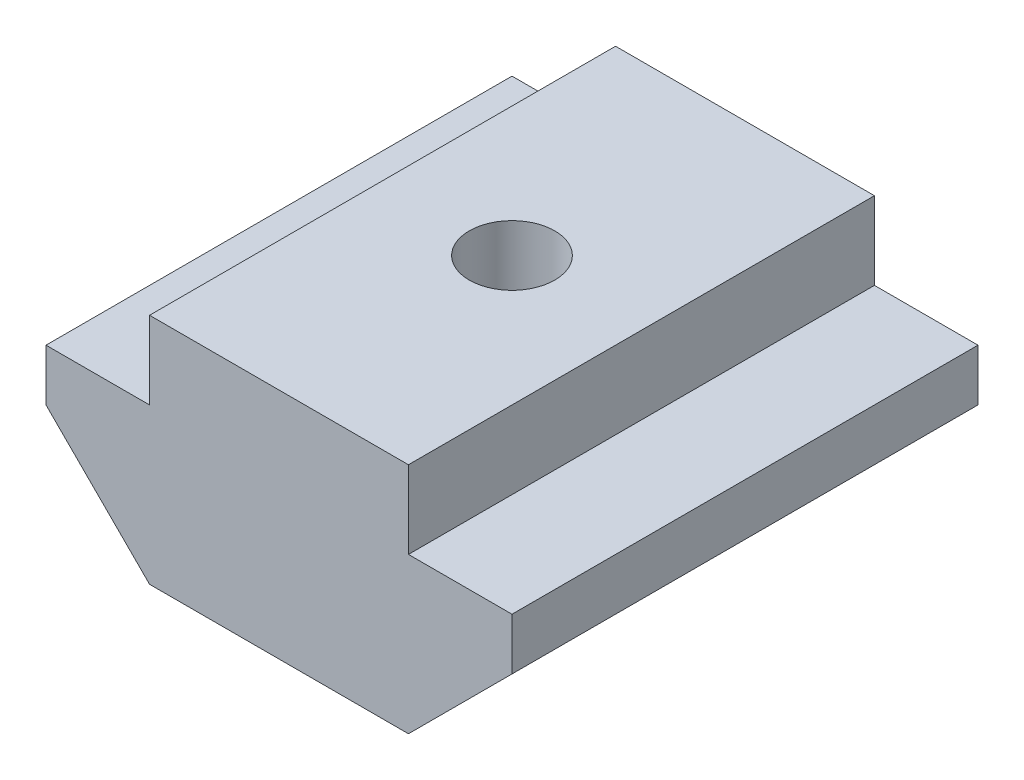
ISO-10303-21;
HEADER;
FILE_DESCRIPTION(('STEP AP214'),'2;1');
FILE_NAME('part.step','',(''),(''),'','','');
FILE_SCHEMA(('AUTOMOTIVE_DESIGN { 1 0 10303 214 1 1 1 1 }'));
ENDSEC;
DATA;
#1=APPLICATION_CONTEXT('core data for automotive mechanical design processes');
#2=APPLICATION_PROTOCOL_DEFINITION('international standard','automotive_design',2000,#1);
#3=PRODUCT_CONTEXT('',#1,'mechanical');
#4=PRODUCT('Part','Part','',(#3));
#5=PRODUCT_RELATED_PRODUCT_CATEGORY('part','',(#4));
#6=PRODUCT_DEFINITION_FORMATION('','',#4);
#7=PRODUCT_DEFINITION_CONTEXT('part definition',#1,'design');
#8=PRODUCT_DEFINITION('design','',#6,#7);
#9=PRODUCT_DEFINITION_SHAPE('','',#8);
#10=(LENGTH_UNIT() NAMED_UNIT(*) SI_UNIT(.MILLI.,.METRE.));
#11=(NAMED_UNIT(*) PLANE_ANGLE_UNIT() SI_UNIT($,.RADIAN.));
#12=(NAMED_UNIT(*) SI_UNIT($,.STERADIAN.) SOLID_ANGLE_UNIT());
#13=UNCERTAINTY_MEASURE_WITH_UNIT(LENGTH_MEASURE(1.E-05),#10,'distance_accuracy_value','');
#14=(GEOMETRIC_REPRESENTATION_CONTEXT(3) GLOBAL_UNCERTAINTY_ASSIGNED_CONTEXT((#13)) GLOBAL_UNIT_ASSIGNED_CONTEXT((#10,
#11,#12)) REPRESENTATION_CONTEXT('',''));
#15=CARTESIAN_POINT('',(0.,0.,0.));
#16=DIRECTION('',(0.,0.,1.));
#17=DIRECTION('',(1.,0.,0.));
#18=AXIS2_PLACEMENT_3D('',#15,#16,#17);
#19=CARTESIAN_POINT('',(0.,-2.,18.));
#20=DIRECTION('',(1.,0.,0.));
#21=DIRECTION('',(0.,0.,-1.));
#22=AXIS2_PLACEMENT_3D('',#19,#20,#21);
#23=PLANE('',#22);
#24=DIRECTION('',(0.,-1.,0.));
#25=VECTOR('',#24,1.);
#26=CARTESIAN_POINT('',(0.,-2.,0.));
#27=LINE('',#26,#25);
#28=CARTESIAN_POINT('',(0.,0.,0.));
#29=VERTEX_POINT('',#28);
#30=CARTESIAN_POINT('',(0.,-2.,0.));
#31=VERTEX_POINT('',#30);
#32=EDGE_CURVE('E153',#29,#31,#27,.T.);
#33=ORIENTED_EDGE('',*,*,#32,.T.);
#34=DIRECTION('',(0.,0.,-1.));
#35=VECTOR('',#34,1.);
#36=CARTESIAN_POINT('',(0.,-2.,18.));
#37=LINE('',#36,#35);
#38=CARTESIAN_POINT('',(0.,-2.,18.));
#39=VERTEX_POINT('',#38);
#40=EDGE_CURVE('E11',#39,#31,#37,.T.);
#41=ORIENTED_EDGE('',*,*,#40,.F.);
#42=DIRECTION('',(0.,-1.,0.));
#43=VECTOR('',#42,1.);
#44=CARTESIAN_POINT('',(0.,-2.,18.));
#45=LINE('',#44,#43);
#46=CARTESIAN_POINT('',(0.,0.,18.));
#47=VERTEX_POINT('',#46);
#48=EDGE_CURVE('E171',#47,#39,#45,.T.);
#49=ORIENTED_EDGE('',*,*,#48,.F.);
#50=DIRECTION('',(0.,0.,-1.));
#51=VECTOR('',#50,1.);
#52=CARTESIAN_POINT('',(0.,0.,18.));
#53=LINE('',#52,#51);
#54=EDGE_CURVE('E149',#47,#29,#53,.T.);
#55=ORIENTED_EDGE('',*,*,#54,.T.);
#56=EDGE_LOOP('',(#33,#41,#49,#55));
#57=FACE_BOUND('',#56,.T.);
#58=ADVANCED_FACE('F44',(#57),#23,.F.);
#59=CARTESIAN_POINT('',(4.,-6.,18.));
#60=DIRECTION('',(0.707106781186548,0.707106781186547,0.));
#61=DIRECTION('',(-0.707106781186547,0.707106781186548,0.));
#62=AXIS2_PLACEMENT_3D('',#59,#60,#61);
#63=PLANE('',#62);
#64=DIRECTION('',(0.707106781186547,-0.707106781186548,0.));
#65=VECTOR('',#64,1.);
#66=CARTESIAN_POINT('',(4.,-6.,0.));
#67=LINE('',#66,#65);
#68=CARTESIAN_POINT('',(4.,-6.,0.));
#69=VERTEX_POINT('',#68);
#70=EDGE_CURVE('E156',#31,#69,#67,.T.);
#71=ORIENTED_EDGE('',*,*,#70,.T.);
#72=DIRECTION('',(0.,0.,-1.));
#73=VECTOR('',#72,1.);
#74=CARTESIAN_POINT('',(4.,-6.,18.));
#75=LINE('',#74,#73);
#76=CARTESIAN_POINT('',(4.,-6.,18.));
#77=VERTEX_POINT('',#76);
#78=EDGE_CURVE('E52',#77,#69,#75,.T.);
#79=ORIENTED_EDGE('',*,*,#78,.F.);
#80=DIRECTION('',(0.707106781186547,-0.707106781186548,0.));
#81=VECTOR('',#80,1.);
#82=CARTESIAN_POINT('',(4.,-6.,18.));
#83=LINE('',#82,#81);
#84=EDGE_CURVE('E109',#39,#77,#83,.T.);
#85=ORIENTED_EDGE('',*,*,#84,.F.);
#86=ORIENTED_EDGE('',*,*,#40,.T.);
#87=EDGE_LOOP('',(#71,#79,#85,#86));
#88=FACE_BOUND('',#87,.T.);
#89=ADVANCED_FACE('F250',(#88),#63,.F.);
#90=CARTESIAN_POINT('',(14.,-6.,18.));
#91=DIRECTION('',(0.,1.,0.));
#92=DIRECTION('',(-1.,0.,0.));
#93=AXIS2_PLACEMENT_3D('',#90,#91,#92);
#94=PLANE('',#93);
#95=CARTESIAN_POINT('',(9.,-6.,9.));
#96=DIRECTION('',(0.,1.,0.));
#97=DIRECTION('',(0.,0.,1.));
#98=AXIS2_PLACEMENT_3D('',#95,#96,#97);
#99=CIRCLE('',#98,1.65);
#100=CARTESIAN_POINT('',(9.,-6.,10.65));
#101=VERTEX_POINT('',#100);
#102=EDGE_CURVE('E222',#101,#101,#99,.T.);
#103=ORIENTED_EDGE('',*,*,#102,.T.);
#104=EDGE_LOOP('',(#103));
#105=FACE_BOUND('',#104,.T.);
#106=DIRECTION('',(1.,0.,0.));
#107=VECTOR('',#106,1.);
#108=CARTESIAN_POINT('',(14.,-6.,0.));
#109=LINE('',#108,#107);
#110=CARTESIAN_POINT('',(14.,-6.,0.));
#111=VERTEX_POINT('',#110);
#112=EDGE_CURVE('E157',#69,#111,#109,.T.);
#113=ORIENTED_EDGE('',*,*,#112,.T.);
#114=DIRECTION('',(0.,0.,-1.));
#115=VECTOR('',#114,1.);
#116=CARTESIAN_POINT('',(14.,-6.,18.));
#117=LINE('',#116,#115);
#118=CARTESIAN_POINT('',(14.,-6.,18.));
#119=VERTEX_POINT('',#118);
#120=EDGE_CURVE('E183',#119,#111,#117,.T.);
#121=ORIENTED_EDGE('',*,*,#120,.F.);
#122=DIRECTION('',(1.,0.,0.));
#123=VECTOR('',#122,1.);
#124=CARTESIAN_POINT('',(14.,-6.,18.));
#125=LINE('',#124,#123);
#126=EDGE_CURVE('E192',#77,#119,#125,.T.);
#127=ORIENTED_EDGE('',*,*,#126,.F.);
#128=ORIENTED_EDGE('',*,*,#78,.T.);
#129=EDGE_LOOP('',(#113,#121,#127,#128));
#130=FACE_BOUND('',#129,.T.);
#131=ADVANCED_FACE('F191',(#105,#130),#94,.F.);
#132=CARTESIAN_POINT('',(18.,-2.,18.));
#133=DIRECTION('',(-0.707106781186548,0.707106781186547,0.));
#134=DIRECTION('',(-0.707106781186547,-0.707106781186548,0.));
#135=AXIS2_PLACEMENT_3D('',#132,#133,#134);
#136=PLANE('',#135);
#137=DIRECTION('',(0.707106781186547,0.707106781186548,0.));
#138=VECTOR('',#137,1.);
#139=CARTESIAN_POINT('',(18.,-2.,0.));
#140=LINE('',#139,#138);
#141=CARTESIAN_POINT('',(18.,-2.,0.));
#142=VERTEX_POINT('',#141);
#143=EDGE_CURVE('E161',#111,#142,#140,.T.);
#144=ORIENTED_EDGE('',*,*,#143,.T.);
#145=DIRECTION('',(0.,0.,-1.));
#146=VECTOR('',#145,1.);
#147=CARTESIAN_POINT('',(18.,-2.,18.));
#148=LINE('',#147,#146);
#149=CARTESIAN_POINT('',(18.,-2.,18.));
#150=VERTEX_POINT('',#149);
#151=EDGE_CURVE('E185',#150,#142,#148,.T.);
#152=ORIENTED_EDGE('',*,*,#151,.F.);
#153=DIRECTION('',(0.707106781186547,0.707106781186548,0.));
#154=VECTOR('',#153,1.);
#155=CARTESIAN_POINT('',(18.,-2.,18.));
#156=LINE('',#155,#154);
#157=EDGE_CURVE('E211',#119,#150,#156,.T.);
#158=ORIENTED_EDGE('',*,*,#157,.F.);
#159=ORIENTED_EDGE('',*,*,#120,.T.);
#160=EDGE_LOOP('',(#144,#152,#158,#159));
#161=FACE_BOUND('',#160,.T.);
#162=ADVANCED_FACE('F205',(#161),#136,.F.);
#163=CARTESIAN_POINT('',(18.,0.,18.));
#164=DIRECTION('',(-1.,0.,0.));
#165=DIRECTION('',(0.,0.,1.));
#166=AXIS2_PLACEMENT_3D('',#163,#164,#165);
#167=PLANE('',#166);
#168=DIRECTION('',(0.,1.,0.));
#169=VECTOR('',#168,1.);
#170=CARTESIAN_POINT('',(18.,0.,0.));
#171=LINE('',#170,#169);
#172=CARTESIAN_POINT('',(18.,0.,0.));
#173=VERTEX_POINT('',#172);
#174=EDGE_CURVE('E162',#142,#173,#171,.T.);
#175=ORIENTED_EDGE('',*,*,#174,.T.);
#176=DIRECTION('',(0.,0.,-1.));
#177=VECTOR('',#176,1.);
#178=CARTESIAN_POINT('',(18.,0.,18.));
#179=LINE('',#178,#177);
#180=CARTESIAN_POINT('',(18.,0.,18.));
#181=VERTEX_POINT('',#180);
#182=EDGE_CURVE('E178',#181,#173,#179,.T.);
#183=ORIENTED_EDGE('',*,*,#182,.F.);
#184=DIRECTION('',(0.,1.,0.));
#185=VECTOR('',#184,1.);
#186=CARTESIAN_POINT('',(18.,0.,18.));
#187=LINE('',#186,#185);
#188=EDGE_CURVE('E208',#150,#181,#187,.T.);
#189=ORIENTED_EDGE('',*,*,#188,.F.);
#190=ORIENTED_EDGE('',*,*,#151,.T.);
#191=EDGE_LOOP('',(#175,#183,#189,#190));
#192=FACE_BOUND('',#191,.T.);
#193=ADVANCED_FACE('F206',(#192),#167,.F.);
#194=CARTESIAN_POINT('',(14.,0.,18.));
#195=DIRECTION('',(0.,-1.,0.));
#196=DIRECTION('',(0.,0.,-1.));
#197=AXIS2_PLACEMENT_3D('',#194,#195,#196);
#198=PLANE('',#197);
#199=DIRECTION('',(-1.,0.,0.));
#200=VECTOR('',#199,1.);
#201=CARTESIAN_POINT('',(14.,0.,0.));
#202=LINE('',#201,#200);
#203=CARTESIAN_POINT('',(14.,0.,0.));
#204=VERTEX_POINT('',#203);
#205=EDGE_CURVE('E164',#173,#204,#202,.T.);
#206=ORIENTED_EDGE('',*,*,#205,.T.);
#207=DIRECTION('',(0.,0.,-1.));
#208=VECTOR('',#207,1.);
#209=CARTESIAN_POINT('',(14.,0.,18.));
#210=LINE('',#209,#208);
#211=CARTESIAN_POINT('',(14.,0.,18.));
#212=VERTEX_POINT('',#211);
#213=EDGE_CURVE('E176',#212,#204,#210,.T.);
#214=ORIENTED_EDGE('',*,*,#213,.F.);
#215=DIRECTION('',(-1.,0.,0.));
#216=VECTOR('',#215,1.);
#217=CARTESIAN_POINT('',(14.,0.,18.));
#218=LINE('',#217,#216);
#219=EDGE_CURVE('E209',#181,#212,#218,.T.);
#220=ORIENTED_EDGE('',*,*,#219,.F.);
#221=ORIENTED_EDGE('',*,*,#182,.T.);
#222=EDGE_LOOP('',(#206,#214,#220,#221));
#223=FACE_BOUND('',#222,.T.);
#224=ADVANCED_FACE('F245',(#223),#198,.F.);
#225=CARTESIAN_POINT('',(14.,3.,18.));
#226=DIRECTION('',(-1.,0.,0.));
#227=DIRECTION('',(0.,-1.,0.));
#228=AXIS2_PLACEMENT_3D('',#225,#226,#227);
#229=PLANE('',#228);
#230=DIRECTION('',(0.,1.,0.));
#231=VECTOR('',#230,1.);
#232=CARTESIAN_POINT('',(14.,3.,0.));
#233=LINE('',#232,#231);
#234=CARTESIAN_POINT('',(14.,3.,0.));
#235=VERTEX_POINT('',#234);
#236=EDGE_CURVE('E170',#204,#235,#233,.T.);
#237=ORIENTED_EDGE('',*,*,#236,.T.);
#238=DIRECTION('',(0.,0.,-1.));
#239=VECTOR('',#238,1.);
#240=CARTESIAN_POINT('',(14.,3.,18.));
#241=LINE('',#240,#239);
#242=CARTESIAN_POINT('',(14.,3.,18.));
#243=VERTEX_POINT('',#242);
#244=EDGE_CURVE('E145',#243,#235,#241,.T.);
#245=ORIENTED_EDGE('',*,*,#244,.F.);
#246=DIRECTION('',(0.,1.,0.));
#247=VECTOR('',#246,1.);
#248=CARTESIAN_POINT('',(14.,3.,18.));
#249=LINE('',#248,#247);
#250=EDGE_CURVE('E132',#212,#243,#249,.T.);
#251=ORIENTED_EDGE('',*,*,#250,.F.);
#252=ORIENTED_EDGE('',*,*,#213,.T.);
#253=EDGE_LOOP('',(#237,#245,#251,#252));
#254=FACE_BOUND('',#253,.T.);
#255=ADVANCED_FACE('F232',(#254),#229,.F.);
#256=CARTESIAN_POINT('',(4.,3.,18.));
#257=DIRECTION('',(0.,-1.,0.));
#258=DIRECTION('',(0.,0.,-1.));
#259=AXIS2_PLACEMENT_3D('',#256,#257,#258);
#260=PLANE('',#259);
#261=CARTESIAN_POINT('',(9.,3.,9.));
#262=DIRECTION('',(0.,1.,0.));
#263=DIRECTION('',(0.,0.,1.));
#264=AXIS2_PLACEMENT_3D('',#261,#262,#263);
#265=CIRCLE('',#264,1.64999999999999);
#266=CARTESIAN_POINT('',(9.,3.,10.65));
#267=VERTEX_POINT('',#266);
#268=EDGE_CURVE('E160',#267,#267,#265,.T.);
#269=ORIENTED_EDGE('',*,*,#268,.F.);
#270=EDGE_LOOP('',(#269));
#271=FACE_BOUND('',#270,.T.);
#272=DIRECTION('',(-1.,0.,0.));
#273=VECTOR('',#272,1.);
#274=CARTESIAN_POINT('',(4.,3.,0.));
#275=LINE('',#274,#273);
#276=CARTESIAN_POINT('',(4.,3.,0.));
#277=VERTEX_POINT('',#276);
#278=EDGE_CURVE('E141',#235,#277,#275,.T.);
#279=ORIENTED_EDGE('',*,*,#278,.T.);
#280=DIRECTION('',(0.,0.,-1.));
#281=VECTOR('',#280,1.);
#282=CARTESIAN_POINT('',(4.,3.,18.));
#283=LINE('',#282,#281);
#284=CARTESIAN_POINT('',(4.,3.,18.));
#285=VERTEX_POINT('',#284);
#286=EDGE_CURVE('E139',#285,#277,#283,.T.);
#287=ORIENTED_EDGE('',*,*,#286,.F.);
#288=DIRECTION('',(-1.,0.,0.));
#289=VECTOR('',#288,1.);
#290=CARTESIAN_POINT('',(4.,3.,18.));
#291=LINE('',#290,#289);
#292=EDGE_CURVE('E129',#243,#285,#291,.T.);
#293=ORIENTED_EDGE('',*,*,#292,.F.);
#294=ORIENTED_EDGE('',*,*,#244,.T.);
#295=EDGE_LOOP('',(#279,#287,#293,#294));
#296=FACE_BOUND('',#295,.T.);
#297=ADVANCED_FACE('F143',(#271,#296),#260,.F.);
#298=CARTESIAN_POINT('',(4.,0.,18.));
#299=DIRECTION('',(1.,0.,0.));
#300=DIRECTION('',(0.,0.,-1.));
#301=AXIS2_PLACEMENT_3D('',#298,#299,#300);
#302=PLANE('',#301);
#303=DIRECTION('',(0.,-1.,0.));
#304=VECTOR('',#303,1.);
#305=CARTESIAN_POINT('',(4.,0.,0.));
#306=LINE('',#305,#304);
#307=CARTESIAN_POINT('',(4.,0.,0.));
#308=VERTEX_POINT('',#307);
#309=EDGE_CURVE('E96',#277,#308,#306,.T.);
#310=ORIENTED_EDGE('',*,*,#309,.T.);
#311=DIRECTION('',(0.,0.,-1.));
#312=VECTOR('',#311,1.);
#313=CARTESIAN_POINT('',(4.,0.,18.));
#314=LINE('',#313,#312);
#315=CARTESIAN_POINT('',(4.,0.,18.));
#316=VERTEX_POINT('',#315);
#317=EDGE_CURVE('E144',#316,#308,#314,.T.);
#318=ORIENTED_EDGE('',*,*,#317,.F.);
#319=DIRECTION('',(0.,-1.,0.));
#320=VECTOR('',#319,1.);
#321=CARTESIAN_POINT('',(4.,0.,18.));
#322=LINE('',#321,#320);
#323=EDGE_CURVE('E135',#285,#316,#322,.T.);
#324=ORIENTED_EDGE('',*,*,#323,.F.);
#325=ORIENTED_EDGE('',*,*,#286,.T.);
#326=EDGE_LOOP('',(#310,#318,#324,#325));
#327=FACE_BOUND('',#326,.T.);
#328=ADVANCED_FACE('F150',(#327),#302,.F.);
#329=CARTESIAN_POINT('',(0.,0.,18.));
#330=DIRECTION('',(0.,-1.,0.));
#331=DIRECTION('',(0.,0.,-1.));
#332=AXIS2_PLACEMENT_3D('',#329,#330,#331);
#333=PLANE('',#332);
#334=DIRECTION('',(-1.,0.,0.));
#335=VECTOR('',#334,1.);
#336=CARTESIAN_POINT('',(0.,0.,0.));
#337=LINE('',#336,#335);
#338=EDGE_CURVE('E105',#308,#29,#337,.T.);
#339=ORIENTED_EDGE('',*,*,#338,.T.);
#340=ORIENTED_EDGE('',*,*,#54,.F.);
#341=DIRECTION('',(-1.,0.,0.));
#342=VECTOR('',#341,1.);
#343=CARTESIAN_POINT('',(0.,0.,18.));
#344=LINE('',#343,#342);
#345=EDGE_CURVE('E64',#316,#47,#344,.T.);
#346=ORIENTED_EDGE('',*,*,#345,.F.);
#347=ORIENTED_EDGE('',*,*,#317,.T.);
#348=EDGE_LOOP('',(#339,#340,#346,#347));
#349=FACE_BOUND('',#348,.T.);
#350=ADVANCED_FACE('F238',(#349),#333,.F.);
#351=CARTESIAN_POINT('',(0.,0.,18.));
#352=DIRECTION('',(0.,0.,-1.));
#353=DIRECTION('',(-1.,0.,0.));
#354=AXIS2_PLACEMENT_3D('',#351,#352,#353);
#355=PLANE('',#354);
#356=ORIENTED_EDGE('',*,*,#48,.T.);
#357=ORIENTED_EDGE('',*,*,#84,.T.);
#358=ORIENTED_EDGE('',*,*,#126,.T.);
#359=ORIENTED_EDGE('',*,*,#157,.T.);
#360=ORIENTED_EDGE('',*,*,#188,.T.);
#361=ORIENTED_EDGE('',*,*,#219,.T.);
#362=ORIENTED_EDGE('',*,*,#250,.T.);
#363=ORIENTED_EDGE('',*,*,#292,.T.);
#364=ORIENTED_EDGE('',*,*,#323,.T.);
#365=ORIENTED_EDGE('',*,*,#345,.T.);
#366=EDGE_LOOP('',(#356,#357,#358,#359,#360,#361,#362,#363,#364,#365));
#367=FACE_BOUND('',#366,.T.);
#368=ADVANCED_FACE('F134',(#367),#355,.F.);
#369=CARTESIAN_POINT('',(0.,0.,0.));
#370=DIRECTION('',(0.,0.,-1.));
#371=DIRECTION('',(-1.,0.,0.));
#372=AXIS2_PLACEMENT_3D('',#369,#370,#371);
#373=PLANE('',#372);
#374=ORIENTED_EDGE('',*,*,#32,.F.);
#375=ORIENTED_EDGE('',*,*,#338,.F.);
#376=ORIENTED_EDGE('',*,*,#309,.F.);
#377=ORIENTED_EDGE('',*,*,#278,.F.);
#378=ORIENTED_EDGE('',*,*,#236,.F.);
#379=ORIENTED_EDGE('',*,*,#205,.F.);
#380=ORIENTED_EDGE('',*,*,#174,.F.);
#381=ORIENTED_EDGE('',*,*,#143,.F.);
#382=ORIENTED_EDGE('',*,*,#112,.F.);
#383=ORIENTED_EDGE('',*,*,#70,.F.);
#384=EDGE_LOOP('',(#374,#375,#376,#377,#378,#379,#380,#381,#382,#383));
#385=FACE_BOUND('',#384,.T.);
#386=ADVANCED_FACE('F197',(#385),#373,.T.);
#387=CARTESIAN_POINT('',(9.,3.,9.));
#388=DIRECTION('',(0.,1.,0.));
#389=DIRECTION('',(0.,0.,1.));
#390=AXIS2_PLACEMENT_3D('',#387,#388,#389);
#391=CYLINDRICAL_SURFACE('',#390,1.64999999999999);
#392=ORIENTED_EDGE('',*,*,#102,.F.);
#393=EDGE_LOOP('',(#392));
#394=FACE_BOUND('',#393,.T.);
#395=ORIENTED_EDGE('',*,*,#268,.T.);
#396=EDGE_LOOP('',(#395));
#397=FACE_BOUND('',#396,.T.);
#398=ADVANCED_FACE('F229',(#394,#397),#391,.F.);
#399=CLOSED_SHELL('',(#58,#89,#131,#162,#193,#224,#255,#297,#328,#350,#368,#386,#398));
#400=MANIFOLD_SOLID_BREP('B2',#399);
#401=ADVANCED_BREP_SHAPE_REPRESENTATION('',(#18,#400),#14);
#402=SHAPE_DEFINITION_REPRESENTATION(#9,#401);
ENDSEC;
END-ISO-10303-21;
